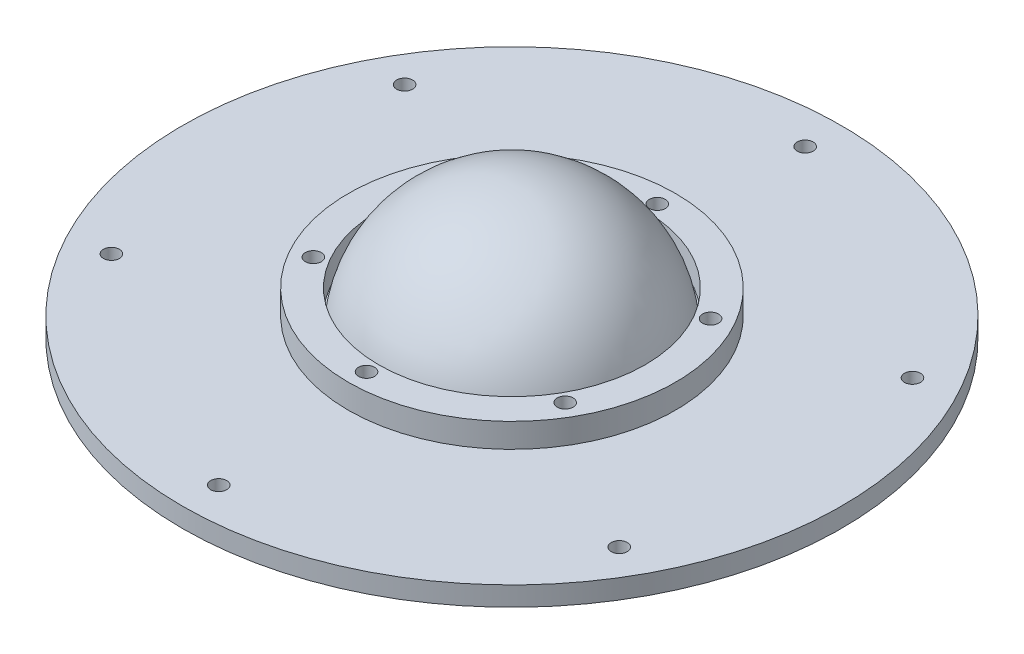
ISO-10303-21;
HEADER;
FILE_DESCRIPTION(('STEP AP214'),'2;1');
FILE_NAME('part.step','',(''),(''),'','','');
FILE_SCHEMA(('AUTOMOTIVE_DESIGN { 1 0 10303 214 1 1 1 1 }'));
ENDSEC;
DATA;
#1=APPLICATION_CONTEXT('core data for automotive mechanical design processes');
#2=APPLICATION_PROTOCOL_DEFINITION('international standard','automotive_design',2000,#1);
#3=PRODUCT_CONTEXT('',#1,'mechanical');
#4=PRODUCT('Part','Part','',(#3));
#5=PRODUCT_RELATED_PRODUCT_CATEGORY('part','',(#4));
#6=PRODUCT_DEFINITION_FORMATION('','',#4);
#7=PRODUCT_DEFINITION_CONTEXT('part definition',#1,'design');
#8=PRODUCT_DEFINITION('design','',#6,#7);
#9=PRODUCT_DEFINITION_SHAPE('','',#8);
#10=(LENGTH_UNIT() NAMED_UNIT(*) SI_UNIT(.MILLI.,.METRE.));
#11=(NAMED_UNIT(*) PLANE_ANGLE_UNIT() SI_UNIT($,.RADIAN.));
#12=(NAMED_UNIT(*) SI_UNIT($,.STERADIAN.) SOLID_ANGLE_UNIT());
#13=UNCERTAINTY_MEASURE_WITH_UNIT(LENGTH_MEASURE(1.E-05),#10,'distance_accuracy_value','');
#14=(GEOMETRIC_REPRESENTATION_CONTEXT(3) GLOBAL_UNCERTAINTY_ASSIGNED_CONTEXT((#13)) GLOBAL_UNIT_ASSIGNED_CONTEXT((#10,
#11,#12)) REPRESENTATION_CONTEXT('',''));
#15=CARTESIAN_POINT('',(0.,0.,0.));
#16=DIRECTION('',(0.,0.,1.));
#17=DIRECTION('',(1.,0.,0.));
#18=AXIS2_PLACEMENT_3D('',#15,#16,#17);
#19=CARTESIAN_POINT('',(0.,8.,0.));
#20=DIRECTION('',(0.,-1.,0.));
#21=DIRECTION('',(0.,0.,-1.));
#22=AXIS2_PLACEMENT_3D('',#19,#20,#21);
#23=CYLINDRICAL_SURFACE('',#22,136.);
#24=CARTESIAN_POINT('',(0.,8.,0.));
#25=DIRECTION('',(0.,1.,0.));
#26=DIRECTION('',(0.,0.,1.));
#27=AXIS2_PLACEMENT_3D('',#24,#25,#26);
#28=CIRCLE('',#27,136.);
#29=CARTESIAN_POINT('',(0.,8.,136.));
#30=VERTEX_POINT('',#29);
#31=EDGE_CURVE('E72',#30,#30,#28,.T.);
#32=ORIENTED_EDGE('',*,*,#31,.F.);
#33=EDGE_LOOP('',(#32));
#34=FACE_BOUND('',#33,.T.);
#35=CARTESIAN_POINT('',(0.,0.,0.));
#36=DIRECTION('',(0.,1.,0.));
#37=DIRECTION('',(0.,0.,1.));
#38=AXIS2_PLACEMENT_3D('',#35,#36,#37);
#39=CIRCLE('',#38,136.);
#40=CARTESIAN_POINT('',(0.,0.,136.));
#41=VERTEX_POINT('',#40);
#42=EDGE_CURVE('E74',#41,#41,#39,.T.);
#43=ORIENTED_EDGE('',*,*,#42,.T.);
#44=EDGE_LOOP('',(#43));
#45=FACE_BOUND('',#44,.T.);
#46=ADVANCED_FACE('F52',(#34,#45),#23,.T.);
#47=CARTESIAN_POINT('',(0.,8.,0.));
#48=DIRECTION('',(0.,1.,0.));
#49=DIRECTION('',(0.,0.,1.));
#50=AXIS2_PLACEMENT_3D('',#47,#48,#49);
#51=PLANE('',#50);
#52=CARTESIAN_POINT('',(0.,8.,0.));
#53=DIRECTION('',(0.,1.,0.));
#54=DIRECTION('',(0.,0.,1.));
#55=AXIS2_PLACEMENT_3D('',#52,#53,#54);
#56=CIRCLE('',#55,67.5);
#57=CARTESIAN_POINT('',(0.,8.,67.5));
#58=VERTEX_POINT('',#57);
#59=EDGE_CURVE('E146',#58,#58,#56,.T.);
#60=ORIENTED_EDGE('',*,*,#59,.F.);
#61=EDGE_LOOP('',(#60));
#62=FACE_BOUND('',#61,.T.);
#63=CARTESIAN_POINT('',(-104.789073857916,8.,-60.5000000000012));
#64=DIRECTION('',(0.,1.,0.));
#65=DIRECTION('',(0.,0.,1.));
#66=AXIS2_PLACEMENT_3D('',#63,#64,#65);
#67=CIRCLE('',#66,3.3);
#68=CARTESIAN_POINT('',(-104.789073857916,8.,-57.2000000000012));
#69=VERTEX_POINT('',#68);
#70=EDGE_CURVE('E105',#69,#69,#67,.T.);
#71=ORIENTED_EDGE('',*,*,#70,.F.);
#72=EDGE_LOOP('',(#71));
#73=FACE_BOUND('',#72,.T.);
#74=CARTESIAN_POINT('',(-104.789073857918,8.,60.499999999999));
#75=DIRECTION('',(0.,1.,0.));
#76=DIRECTION('',(0.,0.,1.));
#77=AXIS2_PLACEMENT_3D('',#74,#75,#76);
#78=CIRCLE('',#77,3.3);
#79=CARTESIAN_POINT('',(-104.789073857918,8.,63.799999999999));
#80=VERTEX_POINT('',#79);
#81=EDGE_CURVE('E109',#80,#80,#78,.T.);
#82=ORIENTED_EDGE('',*,*,#81,.F.);
#83=EDGE_LOOP('',(#82));
#84=FACE_BOUND('',#83,.T.);
#85=CARTESIAN_POINT('',(0.,8.,121.));
#86=DIRECTION('',(0.,1.,0.));
#87=DIRECTION('',(0.,0.,1.));
#88=AXIS2_PLACEMENT_3D('',#85,#86,#87);
#89=CIRCLE('',#88,3.3);
#90=CARTESIAN_POINT('',(0.,8.,124.3));
#91=VERTEX_POINT('',#90);
#92=EDGE_CURVE('E113',#91,#91,#89,.T.);
#93=ORIENTED_EDGE('',*,*,#92,.F.);
#94=EDGE_LOOP('',(#93));
#95=FACE_BOUND('',#94,.T.);
#96=CARTESIAN_POINT('',(104.789073857917,8.,60.5000000000005));
#97=DIRECTION('',(0.,1.,0.));
#98=DIRECTION('',(0.,0.,1.));
#99=AXIS2_PLACEMENT_3D('',#96,#97,#98);
#100=CIRCLE('',#99,3.3);
#101=CARTESIAN_POINT('',(104.789073857917,8.,63.8000000000005));
#102=VERTEX_POINT('',#101);
#103=EDGE_CURVE('E117',#102,#102,#100,.T.);
#104=ORIENTED_EDGE('',*,*,#103,.F.);
#105=EDGE_LOOP('',(#104));
#106=FACE_BOUND('',#105,.T.);
#107=CARTESIAN_POINT('',(104.789073857917,8.,-60.4999999999998));
#108=DIRECTION('',(0.,1.,0.));
#109=DIRECTION('',(0.,0.,1.));
#110=AXIS2_PLACEMENT_3D('',#107,#108,#109);
#111=CIRCLE('',#110,3.3);
#112=CARTESIAN_POINT('',(104.789073857917,8.,-57.1999999999998));
#113=VERTEX_POINT('',#112);
#114=EDGE_CURVE('E121',#113,#113,#111,.T.);
#115=ORIENTED_EDGE('',*,*,#114,.F.);
#116=EDGE_LOOP('',(#115));
#117=FACE_BOUND('',#116,.T.);
#118=CARTESIAN_POINT('',(0.,8.,-121.));
#119=DIRECTION('',(0.,1.,0.));
#120=DIRECTION('',(0.,0.,1.));
#121=AXIS2_PLACEMENT_3D('',#118,#119,#120);
#122=CIRCLE('',#121,3.3);
#123=CARTESIAN_POINT('',(0.,8.,-117.7));
#124=VERTEX_POINT('',#123);
#125=EDGE_CURVE('E94',#124,#124,#122,.T.);
#126=ORIENTED_EDGE('',*,*,#125,.F.);
#127=EDGE_LOOP('',(#126));
#128=FACE_BOUND('',#127,.T.);
#129=ORIENTED_EDGE('',*,*,#31,.T.);
#130=EDGE_LOOP('',(#129));
#131=FACE_BOUND('',#130,.T.);
#132=ADVANCED_FACE('F245',(#62,#73,#84,#95,#106,#117,#128,#131),#51,.T.);
#133=CARTESIAN_POINT('',(-65.,0.,0.));
#134=DIRECTION('',(0.,1.,0.));
#135=DIRECTION('',(-1.,0.,0.));
#136=AXIS2_PLACEMENT_3D('',#133,#134,#135);
#137=PLANE('',#136);
#138=CARTESIAN_POINT('',(-104.789073857916,0.,-60.5000000000012));
#139=DIRECTION('',(0.,-1.,0.));
#140=DIRECTION('',(0.50000000000001,0.,-0.866025403784433));
#141=AXIS2_PLACEMENT_3D('',#138,#139,#140);
#142=CIRCLE('',#141,3.3);
#143=CARTESIAN_POINT('',(-103.139073857916,0.,-63.3578838324899));
#144=VERTEX_POINT('',#143);
#145=EDGE_CURVE('E130',#144,#144,#142,.T.);
#146=ORIENTED_EDGE('',*,*,#145,.F.);
#147=EDGE_LOOP('',(#146));
#148=FACE_BOUND('',#147,.T.);
#149=CARTESIAN_POINT('',(-104.789073857918,0.,60.499999999999));
#150=DIRECTION('',(0.,-1.,0.));
#151=DIRECTION('',(-0.499999999999992,0.,-0.866025403784443));
#152=AXIS2_PLACEMENT_3D('',#149,#150,#151);
#153=CIRCLE('',#152,3.3);
#154=CARTESIAN_POINT('',(-106.439073857918,0.,57.6421161675104));
#155=VERTEX_POINT('',#154);
#156=EDGE_CURVE('E134',#155,#155,#153,.T.);
#157=ORIENTED_EDGE('',*,*,#156,.F.);
#158=EDGE_LOOP('',(#157));
#159=FACE_BOUND('',#158,.T.);
#160=CARTESIAN_POINT('',(0.,0.,121.));
#161=DIRECTION('',(0.,-1.,0.));
#162=DIRECTION('',(-1.,0.,0.));
#163=AXIS2_PLACEMENT_3D('',#160,#161,#162);
#164=CIRCLE('',#163,3.3);
#165=CARTESIAN_POINT('',(-3.3,0.,121.));
#166=VERTEX_POINT('',#165);
#167=EDGE_CURVE('E139',#166,#166,#164,.T.);
#168=ORIENTED_EDGE('',*,*,#167,.F.);
#169=EDGE_LOOP('',(#168));
#170=FACE_BOUND('',#169,.T.);
#171=CARTESIAN_POINT('',(104.789073857917,0.,60.5000000000005));
#172=DIRECTION('',(0.,-1.,0.));
#173=DIRECTION('',(-0.500000000000004,0.,0.866025403784436));
#174=AXIS2_PLACEMENT_3D('',#171,#172,#173);
#175=CIRCLE('',#174,3.3);
#176=CARTESIAN_POINT('',(103.139073857917,0.,63.3578838324892));
#177=VERTEX_POINT('',#176);
#178=EDGE_CURVE('E129',#177,#177,#175,.T.);
#179=ORIENTED_EDGE('',*,*,#178,.F.);
#180=EDGE_LOOP('',(#179));
#181=FACE_BOUND('',#180,.T.);
#182=CARTESIAN_POINT('',(104.789073857917,0.,-60.4999999999998));
#183=DIRECTION('',(0.,-1.,0.));
#184=DIRECTION('',(0.499999999999998,0.,0.86602540378444));
#185=AXIS2_PLACEMENT_3D('',#182,#183,#184);
#186=CIRCLE('',#185,3.3);
#187=CARTESIAN_POINT('',(106.439073857917,0.,-57.6421161675111));
#188=VERTEX_POINT('',#187);
#189=EDGE_CURVE('E125',#188,#188,#186,.T.);
#190=ORIENTED_EDGE('',*,*,#189,.F.);
#191=EDGE_LOOP('',(#190));
#192=FACE_BOUND('',#191,.T.);
#193=CARTESIAN_POINT('',(0.,0.,-121.));
#194=DIRECTION('',(0.,-1.,0.));
#195=DIRECTION('',(1.,0.,0.));
#196=AXIS2_PLACEMENT_3D('',#193,#194,#195);
#197=CIRCLE('',#196,3.3);
#198=CARTESIAN_POINT('',(3.3,0.,-121.));
#199=VERTEX_POINT('',#198);
#200=EDGE_CURVE('E101',#199,#199,#197,.T.);
#201=ORIENTED_EDGE('',*,*,#200,.F.);
#202=EDGE_LOOP('',(#201));
#203=FACE_BOUND('',#202,.T.);
#204=CARTESIAN_POINT('',(0.,0.,0.));
#205=DIRECTION('',(0.,1.,0.));
#206=DIRECTION('',(-1.,0.,0.));
#207=AXIS2_PLACEMENT_3D('',#204,#205,#206);
#208=CIRCLE('',#207,111.5);
#209=CARTESIAN_POINT('',(-111.5,0.,0.));
#210=VERTEX_POINT('',#209);
#211=EDGE_CURVE('E82',#210,#210,#208,.T.);
#212=ORIENTED_EDGE('',*,*,#211,.T.);
#213=EDGE_LOOP('',(#212));
#214=FACE_BOUND('',#213,.T.);
#215=ORIENTED_EDGE('',*,*,#42,.F.);
#216=EDGE_LOOP('',(#215));
#217=FACE_BOUND('',#216,.T.);
#218=ADVANCED_FACE('F54',(#148,#159,#170,#181,#192,#203,#214,#217),#137,.F.);
#219=CARTESIAN_POINT('',(0.,2.,0.));
#220=DIRECTION('',(0.,1.,0.));
#221=DIRECTION('',(-1.,0.,0.));
#222=AXIS2_PLACEMENT_3D('',#219,#220,#221);
#223=PLANE('',#222);
#224=CARTESIAN_POINT('',(0.,2.,0.));
#225=DIRECTION('',(0.,1.,0.));
#226=DIRECTION('',(-1.,0.,0.));
#227=AXIS2_PLACEMENT_3D('',#224,#225,#226);
#228=CIRCLE('',#227,111.5);
#229=CARTESIAN_POINT('',(-111.5,2.00000000000001,0.));
#230=VERTEX_POINT('',#229);
#231=EDGE_CURVE('E78',#230,#230,#228,.T.);
#232=ORIENTED_EDGE('',*,*,#231,.F.);
#233=EDGE_LOOP('',(#232));
#234=FACE_BOUND('',#233,.T.);
#235=CARTESIAN_POINT('',(0.,2.,0.));
#236=DIRECTION('',(0.,1.,0.));
#237=DIRECTION('',(-1.,0.,0.));
#238=AXIS2_PLACEMENT_3D('',#235,#236,#237);
#239=CIRCLE('',#238,108.5);
#240=CARTESIAN_POINT('',(-108.5,2.00000000000001,0.));
#241=VERTEX_POINT('',#240);
#242=EDGE_CURVE('E86',#241,#241,#239,.T.);
#243=ORIENTED_EDGE('',*,*,#242,.T.);
#244=EDGE_LOOP('',(#243));
#245=FACE_BOUND('',#244,.T.);
#246=ADVANCED_FACE('F474',(#234,#245),#223,.F.);
#247=CARTESIAN_POINT('',(0.,2.,0.));
#248=DIRECTION('',(0.,-1.,0.));
#249=DIRECTION('',(1.,0.,0.));
#250=AXIS2_PLACEMENT_3D('',#247,#248,#249);
#251=CYLINDRICAL_SURFACE('',#250,111.5);
#252=ORIENTED_EDGE('',*,*,#231,.T.);
#253=EDGE_LOOP('',(#252));
#254=FACE_BOUND('',#253,.T.);
#255=ORIENTED_EDGE('',*,*,#211,.F.);
#256=EDGE_LOOP('',(#255));
#257=FACE_BOUND('',#256,.T.);
#258=ADVANCED_FACE('F465',(#254,#257),#251,.F.);
#259=CARTESIAN_POINT('',(0.,2.,0.));
#260=DIRECTION('',(0.,-1.,0.));
#261=DIRECTION('',(1.,0.,0.));
#262=AXIS2_PLACEMENT_3D('',#259,#260,#261);
#263=CYLINDRICAL_SURFACE('',#262,108.5);
#264=ORIENTED_EDGE('',*,*,#242,.F.);
#265=EDGE_LOOP('',(#264));
#266=FACE_BOUND('',#265,.T.);
#267=CARTESIAN_POINT('',(0.,0.,0.));
#268=DIRECTION('',(0.,1.,0.));
#269=DIRECTION('',(-1.,0.,0.));
#270=AXIS2_PLACEMENT_3D('',#267,#268,#269);
#271=CIRCLE('',#270,108.5);
#272=CARTESIAN_POINT('',(-108.5,0.,0.));
#273=VERTEX_POINT('',#272);
#274=EDGE_CURVE('E90',#273,#273,#271,.T.);
#275=ORIENTED_EDGE('',*,*,#274,.T.);
#276=EDGE_LOOP('',(#275));
#277=FACE_BOUND('',#276,.T.);
#278=ADVANCED_FACE('F459',(#266,#277),#263,.T.);
#279=ORIENTED_EDGE('',*,*,#274,.F.);
#280=EDGE_LOOP('',(#279));
#281=FACE_BOUND('',#280,.T.);
#282=ADVANCED_FACE('F454',(#281),#137,.F.);
#283=CARTESIAN_POINT('',(0.,22.,-121.));
#284=DIRECTION('',(0.,-1.,0.));
#285=DIRECTION('',(1.,0.,0.));
#286=AXIS2_PLACEMENT_3D('',#283,#284,#285);
#287=CYLINDRICAL_SURFACE('',#286,3.3);
#288=ORIENTED_EDGE('',*,*,#125,.T.);
#289=EDGE_LOOP('',(#288));
#290=FACE_BOUND('',#289,.T.);
#291=ORIENTED_EDGE('',*,*,#200,.T.);
#292=EDGE_LOOP('',(#291));
#293=FACE_BOUND('',#292,.T.);
#294=ADVANCED_FACE('F444',(#290,#293),#287,.F.);
#295=CARTESIAN_POINT('',(104.789073857917,22.,-60.4999999999998));
#296=DIRECTION('',(0.,-1.,0.));
#297=DIRECTION('',(1.,0.,0.));
#298=AXIS2_PLACEMENT_3D('',#295,#296,#297);
#299=CYLINDRICAL_SURFACE('',#298,3.3);
#300=ORIENTED_EDGE('',*,*,#114,.T.);
#301=EDGE_LOOP('',(#300));
#302=FACE_BOUND('',#301,.T.);
#303=ORIENTED_EDGE('',*,*,#189,.T.);
#304=EDGE_LOOP('',(#303));
#305=FACE_BOUND('',#304,.T.);
#306=ADVANCED_FACE('F435',(#302,#305),#299,.F.);
#307=CARTESIAN_POINT('',(104.789073857917,22.,60.5000000000005));
#308=DIRECTION('',(0.,-1.,0.));
#309=DIRECTION('',(1.,0.,0.));
#310=AXIS2_PLACEMENT_3D('',#307,#308,#309);
#311=CYLINDRICAL_SURFACE('',#310,3.3);
#312=ORIENTED_EDGE('',*,*,#103,.T.);
#313=EDGE_LOOP('',(#312));
#314=FACE_BOUND('',#313,.T.);
#315=ORIENTED_EDGE('',*,*,#178,.T.);
#316=EDGE_LOOP('',(#315));
#317=FACE_BOUND('',#316,.T.);
#318=ADVANCED_FACE('F426',(#314,#317),#311,.F.);
#319=CARTESIAN_POINT('',(0.,22.,121.));
#320=DIRECTION('',(0.,-1.,0.));
#321=DIRECTION('',(1.,0.,0.));
#322=AXIS2_PLACEMENT_3D('',#319,#320,#321);
#323=CYLINDRICAL_SURFACE('',#322,3.3);
#324=ORIENTED_EDGE('',*,*,#92,.T.);
#325=EDGE_LOOP('',(#324));
#326=FACE_BOUND('',#325,.T.);
#327=ORIENTED_EDGE('',*,*,#167,.T.);
#328=EDGE_LOOP('',(#327));
#329=FACE_BOUND('',#328,.T.);
#330=ADVANCED_FACE('F417',(#326,#329),#323,.F.);
#331=CARTESIAN_POINT('',(-104.789073857918,22.,60.499999999999));
#332=DIRECTION('',(0.,-1.,0.));
#333=DIRECTION('',(1.,0.,0.));
#334=AXIS2_PLACEMENT_3D('',#331,#332,#333);
#335=CYLINDRICAL_SURFACE('',#334,3.3);
#336=ORIENTED_EDGE('',*,*,#81,.T.);
#337=EDGE_LOOP('',(#336));
#338=FACE_BOUND('',#337,.T.);
#339=ORIENTED_EDGE('',*,*,#156,.T.);
#340=EDGE_LOOP('',(#339));
#341=FACE_BOUND('',#340,.T.);
#342=ADVANCED_FACE('F408',(#338,#341),#335,.F.);
#343=CARTESIAN_POINT('',(-104.789073857916,22.,-60.5000000000012));
#344=DIRECTION('',(0.,-1.,0.));
#345=DIRECTION('',(1.,0.,0.));
#346=AXIS2_PLACEMENT_3D('',#343,#344,#345);
#347=CYLINDRICAL_SURFACE('',#346,3.3);
#348=ORIENTED_EDGE('',*,*,#70,.T.);
#349=EDGE_LOOP('',(#348));
#350=FACE_BOUND('',#349,.T.);
#351=ORIENTED_EDGE('',*,*,#145,.T.);
#352=EDGE_LOOP('',(#351));
#353=FACE_BOUND('',#352,.T.);
#354=ADVANCED_FACE('F219',(#350,#353),#347,.F.);
#355=CARTESIAN_POINT('',(0.,18.,0.));
#356=DIRECTION('',(0.,1.,0.));
#357=DIRECTION('',(0.,0.,1.));
#358=AXIS2_PLACEMENT_3D('',#355,#356,#357);
#359=PLANE('',#358);
#360=CARTESIAN_POINT('',(-51.961524227066,18.,30.0000000000006));
#361=DIRECTION('',(0.,1.,0.));
#362=DIRECTION('',(-0.866025403784433,0.,0.50000000000001));
#363=AXIS2_PLACEMENT_3D('',#360,#361,#362);
#364=CIRCLE('',#363,3.3);
#365=CARTESIAN_POINT('',(-54.8194080595546,18.,31.6500000000006));
#366=VERTEX_POINT('',#365);
#367=EDGE_CURVE('E174',#366,#366,#364,.T.);
#368=ORIENTED_EDGE('',*,*,#367,.F.);
#369=EDGE_LOOP('',(#368));
#370=FACE_BOUND('',#369,.T.);
#371=CARTESIAN_POINT('',(-51.9615242270666,18.,-29.9999999999995));
#372=DIRECTION('',(0.,1.,0.));
#373=DIRECTION('',(-0.866025403784443,0.,-0.499999999999992));
#374=AXIS2_PLACEMENT_3D('',#371,#372,#373);
#375=CIRCLE('',#374,3.3);
#376=CARTESIAN_POINT('',(-54.8194080595553,18.,-31.6499999999995));
#377=VERTEX_POINT('',#376);
#378=EDGE_CURVE('E182',#377,#377,#375,.T.);
#379=ORIENTED_EDGE('',*,*,#378,.F.);
#380=EDGE_LOOP('',(#379));
#381=FACE_BOUND('',#380,.T.);
#382=CARTESIAN_POINT('',(0.,18.,-60.));
#383=DIRECTION('',(0.,1.,0.));
#384=DIRECTION('',(0.,0.,-1.));
#385=AXIS2_PLACEMENT_3D('',#382,#383,#384);
#386=CIRCLE('',#385,3.3);
#387=CARTESIAN_POINT('',(0.,18.,-63.3));
#388=VERTEX_POINT('',#387);
#389=EDGE_CURVE('E190',#388,#388,#386,.T.);
#390=ORIENTED_EDGE('',*,*,#389,.F.);
#391=EDGE_LOOP('',(#390));
#392=FACE_BOUND('',#391,.T.);
#393=CARTESIAN_POINT('',(51.9615242270662,18.,-30.0000000000003));
#394=DIRECTION('',(0.,1.,0.));
#395=DIRECTION('',(0.866025403784436,0.,-0.500000000000004));
#396=AXIS2_PLACEMENT_3D('',#393,#394,#395);
#397=CIRCLE('',#396,3.3);
#398=CARTESIAN_POINT('',(54.8194080595548,18.,-31.6500000000003));
#399=VERTEX_POINT('',#398);
#400=EDGE_CURVE('E198',#399,#399,#397,.T.);
#401=ORIENTED_EDGE('',*,*,#400,.F.);
#402=EDGE_LOOP('',(#401));
#403=FACE_BOUND('',#402,.T.);
#404=CARTESIAN_POINT('',(51.9615242270664,18.,29.9999999999999));
#405=DIRECTION('',(0.,1.,0.));
#406=DIRECTION('',(0.86602540378444,0.,0.499999999999998));
#407=AXIS2_PLACEMENT_3D('',#404,#405,#406);
#408=CIRCLE('',#407,3.3);
#409=CARTESIAN_POINT('',(54.8194080595551,18.,31.6499999999999));
#410=VERTEX_POINT('',#409);
#411=EDGE_CURVE('E166',#410,#410,#408,.T.);
#412=ORIENTED_EDGE('',*,*,#411,.F.);
#413=EDGE_LOOP('',(#412));
#414=FACE_BOUND('',#413,.T.);
#415=CARTESIAN_POINT('',(0.,18.,60.));
#416=DIRECTION('',(0.,1.,0.));
#417=DIRECTION('',(0.,0.,1.));
#418=AXIS2_PLACEMENT_3D('',#415,#416,#417);
#419=CIRCLE('',#418,3.3);
#420=CARTESIAN_POINT('',(0.,18.,63.3));
#421=VERTEX_POINT('',#420);
#422=EDGE_CURVE('E158',#421,#421,#419,.T.);
#423=ORIENTED_EDGE('',*,*,#422,.F.);
#424=EDGE_LOOP('',(#423));
#425=FACE_BOUND('',#424,.T.);
#426=CARTESIAN_POINT('',(0.,18.,0.));
#427=DIRECTION('',(0.,1.,0.));
#428=DIRECTION('',(0.,0.,1.));
#429=AXIS2_PLACEMENT_3D('',#426,#427,#428);
#430=CIRCLE('',#429,67.5);
#431=CARTESIAN_POINT('',(0.,18.,67.5));
#432=VERTEX_POINT('',#431);
#433=EDGE_CURVE('E135',#432,#432,#430,.T.);
#434=ORIENTED_EDGE('',*,*,#433,.T.);
#435=EDGE_LOOP('',(#434));
#436=FACE_BOUND('',#435,.T.);
#437=CARTESIAN_POINT('',(0.,18.,0.));
#438=DIRECTION('',(0.,1.,0.));
#439=DIRECTION('',(0.,0.,1.));
#440=AXIS2_PLACEMENT_3D('',#437,#438,#439);
#441=CIRCLE('',#440,55.);
#442=CARTESIAN_POINT('',(0.,18.,55.));
#443=VERTEX_POINT('',#442);
#444=EDGE_CURVE('E150',#443,#443,#441,.T.);
#445=ORIENTED_EDGE('',*,*,#444,.F.);
#446=EDGE_LOOP('',(#445));
#447=FACE_BOUND('',#446,.T.);
#448=ADVANCED_FACE('F215',(#370,#381,#392,#403,#414,#425,#436,#447),#359,.T.);
#449=CARTESIAN_POINT('',(0.,18.,0.));
#450=DIRECTION('',(0.,-1.,0.));
#451=DIRECTION('',(0.,0.,-1.));
#452=AXIS2_PLACEMENT_3D('',#449,#450,#451);
#453=CYLINDRICAL_SURFACE('',#452,67.5);
#454=ORIENTED_EDGE('',*,*,#433,.F.);
#455=EDGE_LOOP('',(#454));
#456=FACE_BOUND('',#455,.T.);
#457=ORIENTED_EDGE('',*,*,#59,.T.);
#458=EDGE_LOOP('',(#457));
#459=FACE_BOUND('',#458,.T.);
#460=ADVANCED_FACE('F218',(#456,#459),#453,.T.);
#461=CARTESIAN_POINT('',(0.,18.,0.));
#462=DIRECTION('',(0.,-1.,0.));
#463=DIRECTION('',(0.,0.,-1.));
#464=AXIS2_PLACEMENT_3D('',#461,#462,#463);
#465=CYLINDRICAL_SURFACE('',#464,55.);
#466=ORIENTED_EDGE('',*,*,#444,.T.);
#467=EDGE_LOOP('',(#466));
#468=FACE_BOUND('',#467,.T.);
#469=CARTESIAN_POINT('',(0.,8.,0.));
#470=DIRECTION('',(0.,1.,0.));
#471=DIRECTION('',(0.,0.,1.));
#472=AXIS2_PLACEMENT_3D('',#469,#470,#471);
#473=CIRCLE('',#472,55.);
#474=CARTESIAN_POINT('',(0.,8.,55.));
#475=VERTEX_POINT('',#474);
#476=EDGE_CURVE('E11',#475,#475,#473,.F.);
#477=ORIENTED_EDGE('',*,*,#476,.T.);
#478=EDGE_LOOP('',(#477));
#479=FACE_BOUND('',#478,.T.);
#480=ADVANCED_FACE('F230',(#468,#479),#465,.F.);
#481=CARTESIAN_POINT('',(0.,0.,0.));
#482=DIRECTION('',(0.,-1.,0.));
#483=DIRECTION('',(1.,0.,0.));
#484=AXIS2_PLACEMENT_3D('',#481,#482,#483);
#485=SPHERICAL_SURFACE('',#484,55.);
#486=CARTESIAN_POINT('',(0.,8.,0.));
#487=DIRECTION('',(0.,1.,0.));
#488=DIRECTION('',(0.,0.,1.));
#489=AXIS2_PLACEMENT_3D('',#486,#487,#488);
#490=CIRCLE('',#489,54.4150714416512);
#491=CARTESIAN_POINT('',(0.,8.,54.4150714416512));
#492=VERTEX_POINT('',#491);
#493=EDGE_CURVE('E66',#492,#492,#490,.T.);
#494=ORIENTED_EDGE('',*,*,#493,.T.);
#495=EDGE_LOOP('',(#494));
#496=FACE_BOUND('',#495,.T.);
#497=ADVANCED_FACE('F232',(#496),#485,.T.);
#498=ORIENTED_EDGE('',*,*,#493,.F.);
#499=EDGE_LOOP('',(#498));
#500=FACE_BOUND('',#499,.T.);
#501=ORIENTED_EDGE('',*,*,#476,.F.);
#502=EDGE_LOOP('',(#501));
#503=FACE_BOUND('',#502,.T.);
#504=ADVANCED_FACE('F238',(#500,#503),#51,.T.);
#505=CARTESIAN_POINT('',(0.,3.,60.));
#506=DIRECTION('',(0.,1.,0.));
#507=DIRECTION('',(0.,0.,1.));
#508=AXIS2_PLACEMENT_3D('',#505,#506,#507);
#509=CYLINDRICAL_SURFACE('',#508,3.3);
#510=CARTESIAN_POINT('',(0.,3.,60.));
#511=DIRECTION('',(0.,1.,0.));
#512=DIRECTION('',(0.,0.,1.));
#513=AXIS2_PLACEMENT_3D('',#510,#511,#512);
#514=CIRCLE('',#513,3.3);
#515=CARTESIAN_POINT('',(0.,3.,63.3));
#516=VERTEX_POINT('',#515);
#517=EDGE_CURVE('E157',#516,#516,#514,.T.);
#518=ORIENTED_EDGE('',*,*,#517,.F.);
#519=EDGE_LOOP('',(#518));
#520=FACE_BOUND('',#519,.T.);
#521=ORIENTED_EDGE('',*,*,#422,.T.);
#522=EDGE_LOOP('',(#521));
#523=FACE_BOUND('',#522,.T.);
#524=ADVANCED_FACE('F268',(#520,#523),#509,.F.);
#525=CARTESIAN_POINT('',(0.,3.,60.));
#526=DIRECTION('',(0.,1.,0.));
#527=DIRECTION('',(0.,0.,1.));
#528=AXIS2_PLACEMENT_3D('',#525,#526,#527);
#529=PLANE('',#528);
#530=ORIENTED_EDGE('',*,*,#517,.T.);
#531=EDGE_LOOP('',(#530));
#532=FACE_BOUND('',#531,.T.);
#533=ADVANCED_FACE('F273',(#532),#529,.T.);
#534=CARTESIAN_POINT('',(51.9615242270664,3.,29.9999999999999));
#535=DIRECTION('',(0.,1.,0.));
#536=DIRECTION('',(0.,0.,1.));
#537=AXIS2_PLACEMENT_3D('',#534,#535,#536);
#538=CYLINDRICAL_SURFACE('',#537,3.3);
#539=CARTESIAN_POINT('',(51.9615242270664,3.,29.9999999999999));
#540=DIRECTION('',(0.,1.,0.));
#541=DIRECTION('',(0.86602540378444,0.,0.499999999999998));
#542=AXIS2_PLACEMENT_3D('',#539,#540,#541);
#543=CIRCLE('',#542,3.3);
#544=CARTESIAN_POINT('',(54.8194080595551,3.,31.6499999999999));
#545=VERTEX_POINT('',#544);
#546=EDGE_CURVE('E162',#545,#545,#543,.T.);
#547=ORIENTED_EDGE('',*,*,#546,.F.);
#548=EDGE_LOOP('',(#547));
#549=FACE_BOUND('',#548,.T.);
#550=ORIENTED_EDGE('',*,*,#411,.T.);
#551=EDGE_LOOP('',(#550));
#552=FACE_BOUND('',#551,.T.);
#553=ADVANCED_FACE('F280',(#549,#552),#538,.F.);
#554=CARTESIAN_POINT('',(51.9615242270664,3.,29.9999999999999));
#555=DIRECTION('',(0.,1.,0.));
#556=DIRECTION('',(0.86602540378444,0.,0.499999999999998));
#557=AXIS2_PLACEMENT_3D('',#554,#555,#556);
#558=PLANE('',#557);
#559=ORIENTED_EDGE('',*,*,#546,.T.);
#560=EDGE_LOOP('',(#559));
#561=FACE_BOUND('',#560,.T.);
#562=ADVANCED_FACE('F211',(#561),#558,.T.);
#563=CARTESIAN_POINT('',(51.9615242270662,3.,-30.0000000000003));
#564=DIRECTION('',(0.,1.,0.));
#565=DIRECTION('',(0.,0.,1.));
#566=AXIS2_PLACEMENT_3D('',#563,#564,#565);
#567=CYLINDRICAL_SURFACE('',#566,3.3);
#568=CARTESIAN_POINT('',(51.9615242270662,3.,-30.0000000000003));
#569=DIRECTION('',(0.,1.,0.));
#570=DIRECTION('',(0.866025403784436,0.,-0.500000000000004));
#571=AXIS2_PLACEMENT_3D('',#568,#569,#570);
#572=CIRCLE('',#571,3.3);
#573=CARTESIAN_POINT('',(54.8194080595548,3.,-31.6500000000003));
#574=VERTEX_POINT('',#573);
#575=EDGE_CURVE('E170',#574,#574,#572,.T.);
#576=ORIENTED_EDGE('',*,*,#575,.F.);
#577=EDGE_LOOP('',(#576));
#578=FACE_BOUND('',#577,.T.);
#579=ORIENTED_EDGE('',*,*,#400,.T.);
#580=EDGE_LOOP('',(#579));
#581=FACE_BOUND('',#580,.T.);
#582=ADVANCED_FACE('F208',(#578,#581),#567,.F.);
#583=CARTESIAN_POINT('',(51.9615242270662,3.,-30.0000000000003));
#584=DIRECTION('',(0.,1.,0.));
#585=DIRECTION('',(0.866025403784436,0.,-0.500000000000004));
#586=AXIS2_PLACEMENT_3D('',#583,#584,#585);
#587=PLANE('',#586);
#588=ORIENTED_EDGE('',*,*,#575,.T.);
#589=EDGE_LOOP('',(#588));
#590=FACE_BOUND('',#589,.T.);
#591=ADVANCED_FACE('F206',(#590),#587,.T.);
#592=CARTESIAN_POINT('',(0.,3.,-60.));
#593=DIRECTION('',(0.,1.,0.));
#594=DIRECTION('',(0.,0.,1.));
#595=AXIS2_PLACEMENT_3D('',#592,#593,#594);
#596=CYLINDRICAL_SURFACE('',#595,3.3);
#597=CARTESIAN_POINT('',(0.,3.,-60.));
#598=DIRECTION('',(0.,1.,0.));
#599=DIRECTION('',(0.,0.,-1.));
#600=AXIS2_PLACEMENT_3D('',#597,#598,#599);
#601=CIRCLE('',#600,3.3);
#602=CARTESIAN_POINT('',(0.,3.,-63.3));
#603=VERTEX_POINT('',#602);
#604=EDGE_CURVE('E194',#603,#603,#601,.T.);
#605=ORIENTED_EDGE('',*,*,#604,.F.);
#606=EDGE_LOOP('',(#605));
#607=FACE_BOUND('',#606,.T.);
#608=ORIENTED_EDGE('',*,*,#389,.T.);
#609=EDGE_LOOP('',(#608));
#610=FACE_BOUND('',#609,.T.);
#611=ADVANCED_FACE('F308',(#607,#610),#596,.F.);
#612=CARTESIAN_POINT('',(0.,3.,-60.));
#613=DIRECTION('',(0.,1.,0.));
#614=DIRECTION('',(0.,0.,-1.));
#615=AXIS2_PLACEMENT_3D('',#612,#613,#614);
#616=PLANE('',#615);
#617=ORIENTED_EDGE('',*,*,#604,.T.);
#618=EDGE_LOOP('',(#617));
#619=FACE_BOUND('',#618,.T.);
#620=ADVANCED_FACE('F303',(#619),#616,.T.);
#621=CARTESIAN_POINT('',(-51.9615242270666,3.,-29.9999999999995));
#622=DIRECTION('',(0.,1.,0.));
#623=DIRECTION('',(0.,0.,1.));
#624=AXIS2_PLACEMENT_3D('',#621,#622,#623);
#625=CYLINDRICAL_SURFACE('',#624,3.3);
#626=CARTESIAN_POINT('',(-51.9615242270666,3.,-29.9999999999995));
#627=DIRECTION('',(0.,1.,0.));
#628=DIRECTION('',(-0.866025403784443,0.,-0.499999999999992));
#629=AXIS2_PLACEMENT_3D('',#626,#627,#628);
#630=CIRCLE('',#629,3.3);
#631=CARTESIAN_POINT('',(-54.8194080595553,3.,-31.6499999999995));
#632=VERTEX_POINT('',#631);
#633=EDGE_CURVE('E186',#632,#632,#630,.T.);
#634=ORIENTED_EDGE('',*,*,#633,.F.);
#635=EDGE_LOOP('',(#634));
#636=FACE_BOUND('',#635,.T.);
#637=ORIENTED_EDGE('',*,*,#378,.T.);
#638=EDGE_LOOP('',(#637));
#639=FACE_BOUND('',#638,.T.);
#640=ADVANCED_FACE('F300',(#636,#639),#625,.F.);
#641=CARTESIAN_POINT('',(-51.9615242270666,3.,-29.9999999999995));
#642=DIRECTION('',(0.,1.,0.));
#643=DIRECTION('',(-0.866025403784443,0.,-0.499999999999992));
#644=AXIS2_PLACEMENT_3D('',#641,#642,#643);
#645=PLANE('',#644);
#646=ORIENTED_EDGE('',*,*,#633,.T.);
#647=EDGE_LOOP('',(#646));
#648=FACE_BOUND('',#647,.T.);
#649=ADVANCED_FACE('F296',(#648),#645,.T.);
#650=CARTESIAN_POINT('',(-51.961524227066,3.,30.0000000000006));
#651=DIRECTION('',(0.,1.,0.));
#652=DIRECTION('',(0.,0.,1.));
#653=AXIS2_PLACEMENT_3D('',#650,#651,#652);
#654=CYLINDRICAL_SURFACE('',#653,3.3);
#655=CARTESIAN_POINT('',(-51.961524227066,3.,30.0000000000006));
#656=DIRECTION('',(0.,1.,0.));
#657=DIRECTION('',(-0.866025403784433,0.,0.50000000000001));
#658=AXIS2_PLACEMENT_3D('',#655,#656,#657);
#659=CIRCLE('',#658,3.3);
#660=CARTESIAN_POINT('',(-54.8194080595546,3.,31.6500000000006));
#661=VERTEX_POINT('',#660);
#662=EDGE_CURVE('E178',#661,#661,#659,.T.);
#663=ORIENTED_EDGE('',*,*,#662,.F.);
#664=EDGE_LOOP('',(#663));
#665=FACE_BOUND('',#664,.T.);
#666=ORIENTED_EDGE('',*,*,#367,.T.);
#667=EDGE_LOOP('',(#666));
#668=FACE_BOUND('',#667,.T.);
#669=ADVANCED_FACE('F292',(#665,#668),#654,.F.);
#670=CARTESIAN_POINT('',(-51.961524227066,3.,30.0000000000006));
#671=DIRECTION('',(0.,1.,0.));
#672=DIRECTION('',(-0.866025403784433,0.,0.50000000000001));
#673=AXIS2_PLACEMENT_3D('',#670,#671,#672);
#674=PLANE('',#673);
#675=ORIENTED_EDGE('',*,*,#662,.T.);
#676=EDGE_LOOP('',(#675));
#677=FACE_BOUND('',#676,.T.);
#678=ADVANCED_FACE('F295',(#677),#674,.T.);
#679=CLOSED_SHELL('',(#46,#132,#218,#246,#258,#278,#282,#294,#306,#318,#330,#342,#354,#448,#460,
#480,#497,#504,#524,#533,#553,#562,#582,#591,#611,#620,#640,#649,#669,#678));
#680=CARTESIAN_POINT('',(0.,0.,0.));
#681=DIRECTION('',(0.,-1.,0.));
#682=DIRECTION('',(-1.,0.,0.));
#683=AXIS2_PLACEMENT_3D('',#680,#681,#682);
#684=SPHERICAL_SURFACE('',#683,50.);
#685=CARTESIAN_POINT('',(0.,8.,0.));
#686=DIRECTION('',(0.,1.,0.));
#687=DIRECTION('',(0.,0.,1.));
#688=AXIS2_PLACEMENT_3D('',#685,#686,#687);
#689=CIRCLE('',#688,49.3558507170123);
#690=CARTESIAN_POINT('',(0.,8.,49.3558507170123));
#691=VERTEX_POINT('',#690);
#692=EDGE_CURVE('E61',#691,#691,#689,.F.);
#693=ORIENTED_EDGE('',*,*,#692,.T.);
#694=EDGE_LOOP('',(#693));
#695=FACE_BOUND('',#694,.T.);
#696=ADVANCED_FACE('F257',(#695),#684,.F.);
#697=ORIENTED_EDGE('',*,*,#692,.F.);
#698=EDGE_LOOP('',(#697));
#699=FACE_BOUND('',#698,.T.);
#700=ADVANCED_FACE('F253',(#699),#51,.T.);
#701=CLOSED_SHELL('',(#696,#700));
#702=ORIENTED_CLOSED_SHELL('',*,#701,.T.);
#703=BREP_WITH_VOIDS('B2',#679,(#702));
#704=ADVANCED_BREP_SHAPE_REPRESENTATION('',(#18,#703),#14);
#705=SHAPE_DEFINITION_REPRESENTATION(#9,#704);
ENDSEC;
END-ISO-10303-21;
